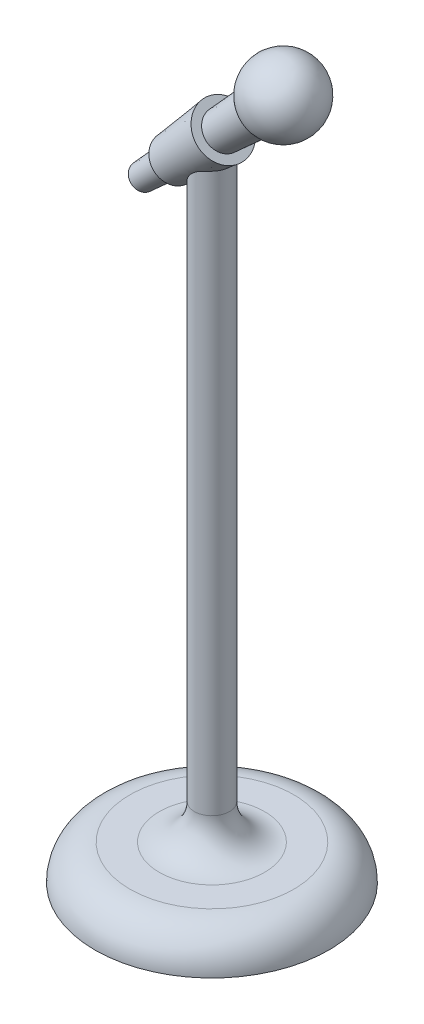
ISO-10303-21;
HEADER;
FILE_DESCRIPTION(('STEP AP214'),'2;1');
FILE_NAME('part.step','',(''),(''),'','','');
FILE_SCHEMA(('AUTOMOTIVE_DESIGN { 1 0 10303 214 1 1 1 1 }'));
ENDSEC;
DATA;
#1=APPLICATION_CONTEXT('core data for automotive mechanical design processes');
#2=APPLICATION_PROTOCOL_DEFINITION('international standard','automotive_design',2000,#1);
#3=PRODUCT_CONTEXT('',#1,'mechanical');
#4=PRODUCT('Part','Part','',(#3));
#5=PRODUCT_RELATED_PRODUCT_CATEGORY('part','',(#4));
#6=PRODUCT_DEFINITION_FORMATION('','',#4);
#7=PRODUCT_DEFINITION_CONTEXT('part definition',#1,'design');
#8=PRODUCT_DEFINITION('design','',#6,#7);
#9=PRODUCT_DEFINITION_SHAPE('','',#8);
#10=(LENGTH_UNIT() NAMED_UNIT(*) SI_UNIT(.MILLI.,.METRE.));
#11=(NAMED_UNIT(*) PLANE_ANGLE_UNIT() SI_UNIT($,.RADIAN.));
#12=(NAMED_UNIT(*) SI_UNIT($,.STERADIAN.) SOLID_ANGLE_UNIT());
#13=UNCERTAINTY_MEASURE_WITH_UNIT(LENGTH_MEASURE(1.E-05),#10,'distance_accuracy_value','');
#14=(GEOMETRIC_REPRESENTATION_CONTEXT(3) GLOBAL_UNCERTAINTY_ASSIGNED_CONTEXT((#13)) GLOBAL_UNIT_ASSIGNED_CONTEXT((#10,
#11,#12)) REPRESENTATION_CONTEXT('',''));
#15=CARTESIAN_POINT('',(0.,0.,0.));
#16=DIRECTION('',(0.,0.,1.));
#17=DIRECTION('',(1.,0.,0.));
#18=AXIS2_PLACEMENT_3D('',#15,#16,#17);
#19=CARTESIAN_POINT('',(0.,110.,0.));
#20=DIRECTION('',(0.,1.,0.));
#21=DIRECTION('',(0.,0.,1.));
#22=AXIS2_PLACEMENT_3D('',#19,#20,#21);
#23=CYLINDRICAL_SURFACE('',#22,2.99999999999999);
#24=CARTESIAN_POINT('',(0.,12.,0.));
#25=DIRECTION('',(0.,1.,0.));
#26=DIRECTION('',(0.,0.,1.));
#27=AXIS2_PLACEMENT_3D('',#24,#25,#26);
#28=CIRCLE('',#27,2.99999999999999);
#29=CARTESIAN_POINT('',(0.,12.,2.99999999999999));
#30=VERTEX_POINT('',#29);
#31=EDGE_CURVE('E55',#30,#30,#28,.T.);
#32=ORIENTED_EDGE('',*,*,#31,.T.);
#33=EDGE_LOOP('',(#32));
#34=FACE_BOUND('',#33,.T.);
#35=CARTESIAN_POINT('',(-2.64549263123303,103.008170282792,-1.41469740159926));
#36=CARTESIAN_POINT('',(-2.60047339527554,103.091250841639,-1.49888887604305));
#37=CARTESIAN_POINT('',(-2.55298302002325,103.178101208303,-1.57807800585887));
#38=CARTESIAN_POINT('',(-2.4540711306352,103.356872465823,-1.72788762418874));
#39=CARTESIAN_POINT('',(-2.40264488320934,103.44879942362,-1.79849752275593));
#40=CARTESIAN_POINT('',(-2.2960611027772,103.636718642481,-1.93274387853897));
#41=CARTESIAN_POINT('',(-2.24087947422393,103.732735313054,-1.99632674355345));
#42=CARTESIAN_POINT('',(-2.12737390839449,103.927061006979,-2.1168669527171));
#43=CARTESIAN_POINT('',(-2.06904889121122,104.02537081147,-2.17382199838316));
#44=CARTESIAN_POINT('',(-1.90953233655082,104.289214652881,-2.31770421152136));
#45=CARTESIAN_POINT('',(-1.80562464432711,104.455982692434,-2.39937945574682));
#46=CARTESIAN_POINT('',(-1.58855778345289,104.790263413185,-2.5482993610367));
#47=CARTESIAN_POINT('',(-1.47538730580302,104.957776761204,-2.61552600757762));
#48=CARTESIAN_POINT('',(-1.29777448743031,105.206579966707,-2.7055734877935));
#49=CARTESIAN_POINT('',(-1.2374273781491,105.288892811629,-2.73373136004484));
#50=CARTESIAN_POINT('',(-1.11370704356931,105.452386817683,-2.78642868551241));
#51=CARTESIAN_POINT('',(-1.05033435869837,105.533568177598,-2.81096878175756));
#52=CARTESIAN_POINT('',(-0.920284767689544,105.694140987001,-2.85618749570059));
#53=CARTESIAN_POINT('',(-0.853613020555469,105.773534965253,-2.87687191550381));
#54=CARTESIAN_POINT('',(-0.716475790370477,105.929967810874,-2.91405384168647));
#55=CARTESIAN_POINT('',(-0.646011775004262,106.00700757153,-2.9305529539394));
#56=CARTESIAN_POINT('',(-0.517076811276809,106.14104442444,-2.95565975580701));
#57=CARTESIAN_POINT('',(-0.459445800021893,106.198672336695,-2.96520702518515));
#58=CARTESIAN_POINT('',(-0.341454190061838,106.311539399296,-2.98109932473261));
#59=CARTESIAN_POINT('',(-0.281093722314742,106.366778663999,-2.98744450835925));
#60=CARTESIAN_POINT('',(-0.157586737737816,106.474265582276,-2.99649729137818));
#61=CARTESIAN_POINT('',(-0.0944429158091388,106.526516021736,-2.99920833284843));
#62=CARTESIAN_POINT('',(0.0346867441495253,106.627464035626,-3.00049409309983));
#63=CARTESIAN_POINT('',(0.1006726195276,106.676161563342,-2.99906875750752));
#64=CARTESIAN_POINT('',(0.236283898052432,106.770024221372,-2.99146220308083));
#65=CARTESIAN_POINT('',(0.305948020960675,106.815128405989,-2.98521281299523));
#66=CARTESIAN_POINT('',(0.447595530501451,106.900367708725,-2.96728012004304));
#67=CARTESIAN_POINT('',(0.51957878756792,106.940503103837,-2.95559712025466));
#68=CARTESIAN_POINT('',(0.665093636476443,107.015269007987,-2.92628618854968));
#69=CARTESIAN_POINT('',(0.738623560407055,107.04990513412,-2.90866438090646));
#70=CARTESIAN_POINT('',(0.886362248392597,107.113464406234,-2.86709713811865));
#71=CARTESIAN_POINT('',(0.960570924887933,107.142388278521,-2.843152507819));
#72=CARTESIAN_POINT('',(1.09905718097962,107.191220560768,-2.79227419886712));
#73=CARTESIAN_POINT('',(1.16338386007269,107.211810151232,-2.76612168558749));
#74=CARTESIAN_POINT('',(1.29103948019813,107.248929607432,-2.70889485022995));
#75=CARTESIAN_POINT('',(1.35436804851607,107.265457988741,-2.67781873531623));
#76=CARTESIAN_POINT('',(1.47934499202774,107.294805167466,-2.6108550495871));
#77=CARTESIAN_POINT('',(1.54099276712083,107.307622655279,-2.57496578669596));
#78=CARTESIAN_POINT('',(1.66199550673234,107.329987017247,-2.49857992870953));
#79=CARTESIAN_POINT('',(1.72134951086916,107.339532534342,-2.4580814311741));
#80=CARTESIAN_POINT('',(1.89199155949459,107.363535898853,-2.33236090947972));
#81=CARTESIAN_POINT('',(1.99940203157154,107.37412227387,-2.24101525515812));
#82=CARTESIAN_POINT('',(2.20047349615035,107.388221840084,-2.04396380679788));
#83=CARTESIAN_POINT('',(2.294133310191,107.39173442537,-1.93825678345179));
#84=CARTESIAN_POINT('',(2.47641867078621,107.394846179576,-1.7007177636131));
#85=CARTESIAN_POINT('',(2.56295981008207,107.393902688097,-1.5672717385115));
#86=CARTESIAN_POINT('',(2.71389058029339,107.390021576439,-1.28839805689116));
#87=CARTESIAN_POINT('',(2.7782715128342,107.387083174555,-1.14296572317801));
#88=CARTESIAN_POINT('',(2.88634705336049,107.381237475476,-0.834957530785075));
#89=CARTESIAN_POINT('',(2.92861004660064,107.37834206896,-0.671876476779809));
#90=CARTESIAN_POINT('',(2.98529158673205,107.374299231519,-0.340925316372386));
#91=CARTESIAN_POINT('',(2.99970881240309,107.373151883535,-0.173054983112971));
#92=CARTESIAN_POINT('',(3.0002832973845,107.373108188965,0.163311639897413));
#93=CARTESIAN_POINT('',(2.98634504689889,107.374219450043,0.331808130672263));
#94=CARTESIAN_POINT('',(2.93043643857248,107.378216243159,0.664031642013621));
#95=CARTESIAN_POINT('',(2.88846629757208,107.381101761472,0.827758699463806));
#96=CARTESIAN_POINT('',(2.77763434560968,107.387137941896,1.14589363131947));
#97=CARTESIAN_POINT('',(2.7087789153423,107.390288540956,1.30030370689588));
#98=CARTESIAN_POINT('',(2.58689582267282,107.393205364528,1.52154573497499));
#99=CARTESIAN_POINT('',(2.54312974527509,107.393875955497,1.59361257666124));
#100=CARTESIAN_POINT('',(2.44969542661019,107.394148528663,1.73380335965108));
#101=CARTESIAN_POINT('',(2.40002957991236,107.393750943,1.80192888405516));
#102=CARTESIAN_POINT('',(2.2952003920022,107.391359489833,1.93368559151237));
#103=CARTESIAN_POINT('',(2.24004159235194,107.389366931612,1.9973204142916));
#104=CARTESIAN_POINT('',(2.12465261619294,107.383169882831,2.11964988793262));
#105=CARTESIAN_POINT('',(2.06442482646817,107.378966428453,2.17834683809435));
#106=CARTESIAN_POINT('',(1.93941054367373,107.367653750446,2.29035569496505));
#107=CARTESIAN_POINT('',(1.87462454295542,107.360544840248,2.34366818176193));
#108=CARTESIAN_POINT('',(1.74117188875044,107.342674602324,2.44444378116846));
#109=CARTESIAN_POINT('',(1.67250753547075,107.331915420961,2.49191030890399));
#110=CARTESIAN_POINT('',(1.53653040620837,107.306811295331,2.57781387601275));
#111=CARTESIAN_POINT('',(1.46940919067293,107.292737775821,2.61663309987668));
#112=CARTESIAN_POINT('',(1.33325042266285,107.260165398266,2.68856238138921));
#113=CARTESIAN_POINT('',(1.26421395218335,107.241668995608,2.72167558927271));
#114=CARTESIAN_POINT('',(1.12513922571999,107.199822719491,2.78204964023233));
#115=CARTESIAN_POINT('',(1.05510202680214,107.176477658941,2.80931623267615));
#116=CARTESIAN_POINT('',(0.914913858240071,107.124707799835,2.85804977033131));
#117=CARTESIAN_POINT('',(0.844762899094579,107.096283446241,2.87951722315084));
#118=CARTESIAN_POINT('',(0.652315619087906,107.010804559561,2.93096577501357));
#119=CARTESIAN_POINT('',(0.530769799668634,106.948372085174,2.95507888729381));
#120=CARTESIAN_POINT('',(0.293949402869777,106.809424475912,2.98797069381963));
#121=CARTESIAN_POINT('',(0.178678266450473,106.732901712914,2.99674105475465));
#122=CARTESIAN_POINT('',(-0.0185186711094017,106.587530964702,3.00117437456127));
#123=CARTESIAN_POINT('',(-0.102066288450372,106.520895005584,2.99936450869202));
#124=CARTESIAN_POINT('',(-0.26436989389465,106.382408111684,2.98943541527173));
#125=CARTESIAN_POINT('',(-0.343123053698873,106.310554152513,2.98131250174448));
#126=CARTESIAN_POINT('',(-0.496319745080047,106.162610716541,2.95967528693756));
#127=CARTESIAN_POINT('',(-0.570744976954427,106.086505594917,2.94613976465523));
#128=CARTESIAN_POINT('',(-0.715386364729527,105.931307502502,2.91439486671458));
#129=CARTESIAN_POINT('',(-0.785600797449988,105.8522133298,2.89618359348871));
#130=CARTESIAN_POINT('',(-0.97982417990427,105.624349513031,2.83852953890741));
#131=CARTESIAN_POINT('',(-1.09934049652414,105.472996037913,2.79412215260998));
#132=CARTESIAN_POINT('',(-1.32818630099235,105.166683056034,2.69287279941887));
#133=CARTESIAN_POINT('',(-1.43750498141963,105.011719936271,2.63601784943276));
#134=CARTESIAN_POINT('',(-1.64741183323974,104.701350815735,2.5101737845173));
#135=CARTESIAN_POINT('',(-1.74801829637784,104.545946487031,2.44121106053304));
#136=CARTESIAN_POINT('',(-1.94165136095143,104.236987134437,2.29020921425625));
#137=CARTESIAN_POINT('',(-2.03468510635494,104.083430486834,2.20818263737717));
#138=CARTESIAN_POINT('',(-2.20309466738055,103.79837701505,2.03933855653894));
#139=CARTESIAN_POINT('',(-2.27926750008994,103.666385573562,1.95417714616224));
#140=CARTESIAN_POINT('',(-2.38882874053517,103.473128205654,1.8157509142567));
#141=CARTESIAN_POINT('',(-2.42460578018964,103.409424656526,1.76776488112865));
#142=CARTESIAN_POINT('',(-2.49438268010654,103.284173828828,1.66786497748563));
#143=CARTESIAN_POINT('',(-2.52838293374041,103.222626073979,1.61595198266273));
#144=CARTESIAN_POINT('',(-2.5948745492002,103.101398746709,1.50690465218895));
#145=CARTESIAN_POINT('',(-2.62733492098151,103.041762084084,1.44970266092958));
#146=CARTESIAN_POINT('',(-2.68976461590381,102.926341747631,1.33030678649064));
#147=CARTESIAN_POINT('',(-2.71973282903106,102.870559792549,1.26811070291531));
#148=CARTESIAN_POINT('',(-2.80482940574253,102.711299240084,1.07370933031777));
#149=CARTESIAN_POINT('',(-2.85563800157567,102.615009343414,0.932930424476044));
#150=CARTESIAN_POINT('',(-2.9168006306719,102.498385817878,0.705833662276592));
#151=CARTESIAN_POINT('',(-2.93455186789151,102.464397283151,0.628507885659998));
#152=CARTESIAN_POINT('',(-2.96425334319501,102.407406234862,0.468805706646798));
#153=CARTESIAN_POINT('',(-2.97620954315829,102.384392430995,0.386434593565669));
#154=CARTESIAN_POINT('',(-2.99330660088874,102.351453649814,0.217616085110647));
#155=CARTESIAN_POINT('',(-2.99838912309938,102.341640709308,0.131140167904876));
#156=CARTESIAN_POINT('',(-3.00095371916157,102.336691454725,-0.0423400165340725));
#157=CARTESIAN_POINT('',(-2.99843818552855,102.341550520649,-0.129344108842454));
#158=CARTESIAN_POINT('',(-2.98670320270302,102.364178091228,-0.292726083107217));
#159=CARTESIAN_POINT('',(-2.97813618913633,102.380690096301,-0.369334028489208));
#160=CARTESIAN_POINT('',(-2.95575562189722,102.423721002971,-0.518882159176033));
#161=CARTESIAN_POINT('',(-2.94193708136294,102.450249416016,-0.591818783401515));
#162=CARTESIAN_POINT('',(-2.90133729891432,102.527936648319,-0.771144496457591));
#163=CARTESIAN_POINT('',(-2.8715816434327,102.584668493202,-0.874424052525405));
#164=CARTESIAN_POINT('',(-2.80469434067277,102.711298704266,-1.0697701547774));
#165=CARTESIAN_POINT('',(-2.76755106241954,102.781217823221,-1.16181864545332));
#166=CARTESIAN_POINT('',(-2.71458344857265,102.880075991722,-1.27750947612049));
#167=CARTESIAN_POINT('',(-2.7011239712717,102.90513143439,-1.30571175604677));
#168=CARTESIAN_POINT('',(-2.67368873140372,102.95605702059,-1.36100690477234));
#169=CARTESIAN_POINT('',(-2.65971397830478,102.981925557906,-1.38810174414123));
#170=CARTESIAN_POINT('',(-2.64549263123303,103.008170282792,-1.41469740159926));
#171=B_SPLINE_CURVE_WITH_KNOTS('',3,(#35,#36,#37,#38,#39,#40,#41,#42,#43,#44,#45,#46,#47,#48,
#49,#50,#51,#52,#53,#54,#55,#56,#57,#58,#59,#60,#61,#62,#63,#64,#65,#66,#67,#68,#69,#70,#71,#72,
#73,#74,#75,#76,#77,#78,#79,#80,#81,#82,#83,#84,#85,#86,#87,#88,#89,#90,#91,#92,#93,#94,#95,#96,
#97,#98,#99,#100,#101,#102,#103,#104,#105,#106,#107,#108,#109,#110,#111,#112,#113,#114,#115,
#116,#117,#118,#119,#120,#121,#122,#123,#124,#125,#126,#127,#128,#129,#130,#131,#132,#133,#134,
#135,#136,#137,#138,#139,#140,#141,#142,#143,#144,#145,#146,#147,#148,#149,#150,#151,#152,#153,
#154,#155,#156,#157,#158,#159,#160,#161,#162,#163,#164,#165,#166,#167,#168,#169,#170),
.UNSPECIFIED.,.T.,.F.,(4,2,2,2,2,2,2,2,2,2,2,2,2,2,2,2,2,2,2,2,2,2,2,2,2,2,2,2,2,2,2,2,2,2,2,2,
2,2,2,2,2,2,2,2,2,2,2,2,2,2,2,2,2,2,2,2,2,2,2,2,2,2,2,2,2,2,2,4),(0.,0.379632130098834,
0.759728205986143,1.14254779296163,1.52549974603111,2.1630849573144,2.80146055712261,
3.11900462748386,3.4364921888622,3.75349806156303,4.07038211670037,4.31643362677783,
4.56247334391942,4.80827985948303,5.05408960623358,5.30343807959937,5.55277264636682,
5.80185087477892,6.05089741278892,6.26789537809515,6.48497254145212,6.70212621992867,
6.91936985486112,7.34173055617524,7.76412743361344,8.23920040850829,8.71445964803855,
9.21754070243324,9.7206456263273,10.2254479649472,10.730246398719,11.2349251012597,
11.4876301516606,11.7402329835911,11.9926286711819,12.2449061736187,12.4971564682219,
12.7492586956917,12.9853348660528,13.2212802805864,13.4569925992135,13.6926842788649,
14.1069017561766,14.5213441431113,14.8415389652321,15.1619208789178,15.4835714140132,
15.8053526919663,16.3981143003568,16.991497143315,17.5836023111612,18.1751422625614,
18.6981481409383,18.9602735086608,19.2223405951303,19.4884116401317,19.7546005661019,
20.2831944975582,20.5413146542625,20.7991686927507,21.0591976371121,21.3191447107418,
21.5546552994843,21.7903900907051,22.1529286814491,22.516042631771,22.636190515154,
22.7561143691888),.UNSPECIFIED.);
#172=CARTESIAN_POINT('',(-2.64549263123303,103.008170282792,-1.41469740159926));
#173=VERTEX_POINT('',#172);
#174=EDGE_CURVE('E61',#173,#173,#171,.T.);
#175=ORIENTED_EDGE('',*,*,#174,.T.);
#176=EDGE_LOOP('',(#175));
#177=FACE_BOUND('',#176,.T.);
#178=ADVANCED_FACE('F39',(#34,#177),#23,.T.);
#179=CARTESIAN_POINT('',(-2.99999999999999,6.,0.));
#180=DIRECTION('',(0.,1.,0.));
#181=DIRECTION('',(0.,0.,1.));
#182=AXIS2_PLACEMENT_3D('',#179,#180,#181);
#183=PLANE('',#182);
#184=CARTESIAN_POINT('',(0.,6.,0.));
#185=DIRECTION('',(0.,1.,0.));
#186=DIRECTION('',(0.,0.,1.));
#187=AXIS2_PLACEMENT_3D('',#184,#185,#186);
#188=CIRCLE('',#187,14.);
#189=CARTESIAN_POINT('',(0.,6.,14.));
#190=VERTEX_POINT('',#189);
#191=EDGE_CURVE('E10',#190,#190,#188,.T.);
#192=ORIENTED_EDGE('',*,*,#191,.T.);
#193=EDGE_LOOP('',(#192));
#194=FACE_BOUND('',#193,.T.);
#195=CARTESIAN_POINT('',(0.,6.,0.));
#196=DIRECTION('',(0.,1.,0.));
#197=DIRECTION('',(0.,0.,1.));
#198=AXIS2_PLACEMENT_3D('',#195,#196,#197);
#199=CIRCLE('',#198,8.99999999999999);
#200=CARTESIAN_POINT('',(0.,6.,8.99999999999999));
#201=VERTEX_POINT('',#200);
#202=EDGE_CURVE('E50',#201,#201,#199,.F.);
#203=ORIENTED_EDGE('',*,*,#202,.T.);
#204=EDGE_LOOP('',(#203));
#205=FACE_BOUND('',#204,.T.);
#206=ADVANCED_FACE('F97',(#194,#205),#183,.T.);
#207=CARTESIAN_POINT('',(-20.,0.,0.));
#208=DIRECTION('',(0.,-1.,0.));
#209=DIRECTION('',(0.,0.,-1.));
#210=AXIS2_PLACEMENT_3D('',#207,#208,#209);
#211=PLANE('',#210);
#212=CARTESIAN_POINT('',(0.,0.,0.));
#213=DIRECTION('',(0.,1.,0.));
#214=DIRECTION('',(0.,0.,1.));
#215=AXIS2_PLACEMENT_3D('',#212,#213,#214);
#216=CIRCLE('',#215,20.);
#217=CARTESIAN_POINT('',(0.,0.,20.));
#218=VERTEX_POINT('',#217);
#219=EDGE_CURVE('E112',#218,#218,#216,.T.);
#220=ORIENTED_EDGE('',*,*,#219,.F.);
#221=EDGE_LOOP('',(#220));
#222=FACE_BOUND('',#221,.T.);
#223=ADVANCED_FACE('F95',(#222),#211,.T.);
#224=CARTESIAN_POINT('',(0.,12.,0.));
#225=DIRECTION('',(0.,1.,0.));
#226=DIRECTION('',(0.,0.,1.));
#227=AXIS2_PLACEMENT_3D('',#224,#225,#226);
#228=TOROIDAL_SURFACE('',#227,8.99999999999999,6.);
#229=ORIENTED_EDGE('',*,*,#202,.F.);
#230=EDGE_LOOP('',(#229));
#231=FACE_BOUND('',#230,.T.);
#232=ORIENTED_EDGE('',*,*,#31,.F.);
#233=EDGE_LOOP('',(#232));
#234=FACE_BOUND('',#233,.T.);
#235=ADVANCED_FACE('F78',(#231,#234),#228,.F.);
#236=CARTESIAN_POINT('',(1.93654675399705,112.332765698033,0.));
#237=DIRECTION('',(0.707106781186551,0.707106781186544,0.));
#238=DIRECTION('',(0.707106781186544,-0.707106781186551,0.));
#239=AXIS2_PLACEMENT_3D('',#236,#237,#238);
#240=CONICAL_SURFACE('',#239,4.5,0.0872664625997165);
#241=ORIENTED_EDGE('',*,*,#174,.F.);
#242=EDGE_LOOP('',(#241));
#243=FACE_BOUND('',#242,.T.);
#244=CARTESIAN_POINT('',(-6.54873462024156,103.847484323794,0.));
#245=DIRECTION('',(-0.707106781186551,-0.707106781186544,0.));
#246=DIRECTION('',(0.707106781186544,-0.707106781186551,0.));
#247=AXIS2_PLACEMENT_3D('',#244,#245,#246);
#248=CIRCLE('',#247,3.45013603768891);
#249=CARTESIAN_POINT('',(-4.10912003197566,101.407869735528,0.));
#250=VERTEX_POINT('',#249);
#251=EDGE_CURVE('E62',#250,#250,#248,.T.);
#252=ORIENTED_EDGE('',*,*,#251,.F.);
#253=EDGE_LOOP('',(#252));
#254=FACE_BOUND('',#253,.T.);
#255=CARTESIAN_POINT('',(1.93654675399705,112.332765698033,0.));
#256=DIRECTION('',(-0.707106781186551,-0.707106781186544,0.));
#257=DIRECTION('',(0.707106781186544,-0.707106781186551,0.));
#258=AXIS2_PLACEMENT_3D('',#255,#256,#257);
#259=CIRCLE('',#258,4.5);
#260=CARTESIAN_POINT('',(5.1185272693365,109.150785182693,0.));
#261=VERTEX_POINT('',#260);
#262=EDGE_CURVE('E123',#261,#261,#259,.T.);
#263=ORIENTED_EDGE('',*,*,#262,.T.);
#264=EDGE_LOOP('',(#263));
#265=FACE_BOUND('',#264,.T.);
#266=ADVANCED_FACE('F72',(#243,#254,#265),#240,.T.);
#267=CARTESIAN_POINT('',(-6.54873462024156,103.847484323794,0.));
#268=DIRECTION('',(-0.707106781186551,-0.707106781186544,0.));
#269=DIRECTION('',(0.707106781186544,-0.707106781186551,0.));
#270=AXIS2_PLACEMENT_3D('',#267,#268,#269);
#271=PLANE('',#270);
#272=CARTESIAN_POINT('',(-6.54873462024158,103.847484323794,0.));
#273=DIRECTION('',(-0.707106781186551,-0.707106781186544,0.));
#274=DIRECTION('',(0.707106781186544,-0.707106781186551,0.));
#275=AXIS2_PLACEMENT_3D('',#272,#273,#274);
#276=CIRCLE('',#275,2.39305834462282);
#277=CARTESIAN_POINT('',(-4.85658683698374,102.155336540536,0.));
#278=VERTEX_POINT('',#277);
#279=EDGE_CURVE('E59',#278,#278,#276,.T.);
#280=ORIENTED_EDGE('',*,*,#279,.F.);
#281=EDGE_LOOP('',(#280));
#282=FACE_BOUND('',#281,.T.);
#283=ORIENTED_EDGE('',*,*,#251,.T.);
#284=EDGE_LOOP('',(#283));
#285=FACE_BOUND('',#284,.T.);
#286=ADVANCED_FACE('F77',(#282,#285),#271,.T.);
#287=CARTESIAN_POINT('',(1.93654675399705,112.332765698033,0.));
#288=DIRECTION('',(-0.707106781186551,-0.707106781186544,0.));
#289=DIRECTION('',(0.707106781186544,-0.707106781186551,0.));
#290=AXIS2_PLACEMENT_3D('',#287,#288,#289);
#291=PLANE('',#290);
#292=CARTESIAN_POINT('',(1.93654675399704,112.332765698033,0.));
#293=DIRECTION('',(-0.707106781186551,-0.707106781186544,0.));
#294=DIRECTION('',(0.707106781186544,-0.707106781186551,0.));
#295=AXIS2_PLACEMENT_3D('',#292,#293,#294);
#296=CIRCLE('',#295,3.02195169601932);
#297=CARTESIAN_POINT('',(4.07338929067048,110.195923161359,0.));
#298=VERTEX_POINT('',#297);
#299=EDGE_CURVE('E46',#298,#298,#296,.T.);
#300=ORIENTED_EDGE('',*,*,#299,.T.);
#301=EDGE_LOOP('',(#300));
#302=FACE_BOUND('',#301,.T.);
#303=ORIENTED_EDGE('',*,*,#262,.F.);
#304=EDGE_LOOP('',(#303));
#305=FACE_BOUND('',#304,.T.);
#306=ADVANCED_FACE('F80',(#302,#305),#291,.F.);
#307=CARTESIAN_POINT('',(12.1895950812021,122.585814025238,0.));
#308=DIRECTION('',(-0.707106781186551,-0.707106781186544,0.));
#309=DIRECTION('',(-0.707106781186544,0.707106781186551,0.));
#310=AXIS2_PLACEMENT_3D('',#307,#308,#309);
#311=SPHERICAL_SURFACE('',#310,6.);
#312=CARTESIAN_POINT('',(8.7576327847679,119.153851728803,0.));
#313=DIRECTION('',(-0.707106781186551,-0.707106781186544,0.));
#314=DIRECTION('',(0.707106781186544,-0.707106781186551,0.));
#315=AXIS2_PLACEMENT_3D('',#312,#313,#314);
#316=CIRCLE('',#315,3.52750189109936);
#317=CARTESIAN_POINT('',(11.2519532926126,116.659531220959,0.));
#318=VERTEX_POINT('',#317);
#319=EDGE_CURVE('E114',#318,#318,#316,.T.);
#320=ORIENTED_EDGE('',*,*,#319,.F.);
#321=EDGE_LOOP('',(#320));
#322=FACE_BOUND('',#321,.T.);
#323=ADVANCED_FACE('F91',(#322),#311,.T.);
#324=CARTESIAN_POINT('',(8.7576327847679,119.153851728803,0.));
#325=DIRECTION('',(0.707106781186551,0.707106781186544,0.));
#326=DIRECTION('',(-0.707106781186544,0.707106781186551,0.));
#327=AXIS2_PLACEMENT_3D('',#324,#325,#326);
#328=CONICAL_SURFACE('',#327,3.52750189109936,0.0523598775598307);
#329=ORIENTED_EDGE('',*,*,#319,.T.);
#330=EDGE_LOOP('',(#329));
#331=FACE_BOUND('',#330,.T.);
#332=ORIENTED_EDGE('',*,*,#299,.F.);
#333=EDGE_LOOP('',(#332));
#334=FACE_BOUND('',#333,.T.);
#335=ADVANCED_FACE('F86',(#331,#334),#328,.T.);
#336=CARTESIAN_POINT('',(-11.8520354791407,98.544183464895,0.));
#337=DIRECTION('',(0.707106781186551,0.707106781186544,0.));
#338=DIRECTION('',(-0.707106781186544,0.707106781186551,0.));
#339=AXIS2_PLACEMENT_3D('',#336,#337,#338);
#340=PLANE('',#339);
#341=CARTESIAN_POINT('',(-11.8520354791407,98.544183464895,0.));
#342=DIRECTION('',(-0.707106781186551,-0.707106781186544,0.));
#343=DIRECTION('',(0.707106781186544,-0.707106781186551,0.));
#344=AXIS2_PLACEMENT_3D('',#341,#342,#343);
#345=CIRCLE('',#344,2.);
#346=CARTESIAN_POINT('',(-10.4378219167676,97.1299699025219,0.));
#347=VERTEX_POINT('',#346);
#348=EDGE_CURVE('E69',#347,#347,#345,.T.);
#349=ORIENTED_EDGE('',*,*,#348,.T.);
#350=EDGE_LOOP('',(#349));
#351=FACE_BOUND('',#350,.T.);
#352=ADVANCED_FACE('F82',(#351),#340,.F.);
#353=ORIENTED_EDGE('',*,*,#279,.T.);
#354=EDGE_LOOP('',(#353));
#355=FACE_BOUND('',#354,.T.);
#356=ORIENTED_EDGE('',*,*,#348,.F.);
#357=EDGE_LOOP('',(#356));
#358=FACE_BOUND('',#357,.T.);
#359=ADVANCED_FACE('F85',(#355,#358),#328,.T.);
#360=CARTESIAN_POINT('',(0.,0.,0.));
#361=DIRECTION('',(0.,1.,0.));
#362=DIRECTION('',(0.,0.,1.));
#363=AXIS2_PLACEMENT_3D('',#360,#361,#362);
#364=TOROIDAL_SURFACE('',#363,14.,6.);
#365=ORIENTED_EDGE('',*,*,#219,.T.);
#366=EDGE_LOOP('',(#365));
#367=FACE_BOUND('',#366,.T.);
#368=ORIENTED_EDGE('',*,*,#191,.F.);
#369=EDGE_LOOP('',(#368));
#370=FACE_BOUND('',#369,.T.);
#371=ADVANCED_FACE('F41',(#367,#370),#364,.T.);
#372=CLOSED_SHELL('',(#178,#206,#223,#235,#266,#286,#306,#323,#335,#352,#359,#371));
#373=MANIFOLD_SOLID_BREP('B2',#372);
#374=ADVANCED_BREP_SHAPE_REPRESENTATION('',(#18,#373),#14);
#375=SHAPE_DEFINITION_REPRESENTATION(#9,#374);
ENDSEC;
END-ISO-10303-21;
